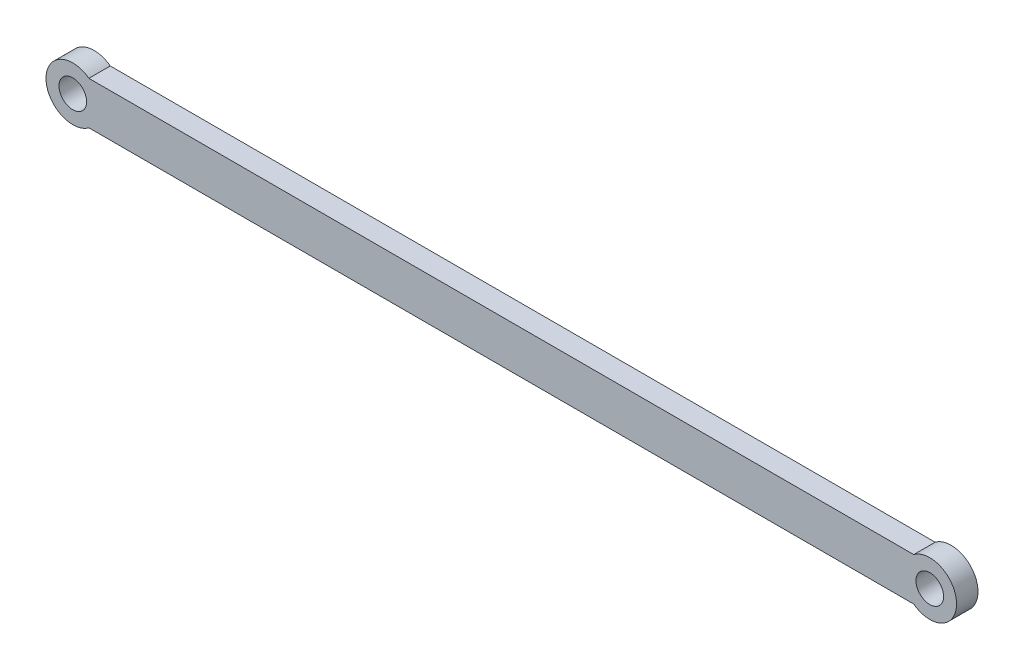
ISO-10303-21;
HEADER;
FILE_DESCRIPTION(('STEP AP214'),'2;1');
FILE_NAME('part.step','',(''),(''),'','','');
FILE_SCHEMA(('AUTOMOTIVE_DESIGN { 1 0 10303 214 1 1 1 1 }'));
ENDSEC;
DATA;
#1=APPLICATION_CONTEXT('core data for automotive mechanical design processes');
#2=APPLICATION_PROTOCOL_DEFINITION('international standard','automotive_design',2000,#1);
#3=PRODUCT_CONTEXT('',#1,'mechanical');
#4=PRODUCT('Part','Part','',(#3));
#5=PRODUCT_RELATED_PRODUCT_CATEGORY('part','',(#4));
#6=PRODUCT_DEFINITION_FORMATION('','',#4);
#7=PRODUCT_DEFINITION_CONTEXT('part definition',#1,'design');
#8=PRODUCT_DEFINITION('design','',#6,#7);
#9=PRODUCT_DEFINITION_SHAPE('','',#8);
#10=(LENGTH_UNIT() NAMED_UNIT(*) SI_UNIT(.MILLI.,.METRE.));
#11=(NAMED_UNIT(*) PLANE_ANGLE_UNIT() SI_UNIT($,.RADIAN.));
#12=(NAMED_UNIT(*) SI_UNIT($,.STERADIAN.) SOLID_ANGLE_UNIT());
#13=UNCERTAINTY_MEASURE_WITH_UNIT(LENGTH_MEASURE(1.E-05),#10,'distance_accuracy_value','');
#14=(GEOMETRIC_REPRESENTATION_CONTEXT(3) GLOBAL_UNCERTAINTY_ASSIGNED_CONTEXT((#13)) GLOBAL_UNIT_ASSIGNED_CONTEXT((#10,
#11,#12)) REPRESENTATION_CONTEXT('',''));
#15=CARTESIAN_POINT('',(0.,0.,0.));
#16=DIRECTION('',(0.,0.,1.));
#17=DIRECTION('',(1.,0.,0.));
#18=AXIS2_PLACEMENT_3D('',#15,#16,#17);
#19=CARTESIAN_POINT('',(0.,6.35,6.35));
#20=DIRECTION('',(0.,0.,-1.));
#21=DIRECTION('',(-1.,0.,0.));
#22=AXIS2_PLACEMENT_3D('',#19,#20,#21);
#23=CYLINDRICAL_SURFACE('',#22,7.9375);
#24=CARTESIAN_POINT('',(0.,6.35,0.));
#25=DIRECTION('',(0.,0.,1.));
#26=DIRECTION('',(1.,0.,0.));
#27=AXIS2_PLACEMENT_3D('',#24,#25,#26);
#28=CIRCLE('',#27,7.9375);
#29=CARTESIAN_POINT('',(4.7625,12.7,0.));
#30=VERTEX_POINT('',#29);
#31=CARTESIAN_POINT('',(4.7625,0.,0.));
#32=VERTEX_POINT('',#31);
#33=EDGE_CURVE('E107',#30,#32,#28,.T.);
#34=ORIENTED_EDGE('',*,*,#33,.T.);
#35=DIRECTION('',(0.,0.,-1.));
#36=VECTOR('',#35,1.);
#37=CARTESIAN_POINT('',(4.7625,0.,6.35));
#38=LINE('',#37,#36);
#39=CARTESIAN_POINT('',(4.7625,0.,6.35));
#40=VERTEX_POINT('',#39);
#41=EDGE_CURVE('E11',#40,#32,#38,.T.);
#42=ORIENTED_EDGE('',*,*,#41,.F.);
#43=CARTESIAN_POINT('',(0.,6.35,6.35));
#44=DIRECTION('',(0.,0.,1.));
#45=DIRECTION('',(1.,0.,0.));
#46=AXIS2_PLACEMENT_3D('',#43,#44,#45);
#47=CIRCLE('',#46,7.9375);
#48=CARTESIAN_POINT('',(4.7625,12.7,6.35));
#49=VERTEX_POINT('',#48);
#50=EDGE_CURVE('E91',#49,#40,#47,.T.);
#51=ORIENTED_EDGE('',*,*,#50,.F.);
#52=DIRECTION('',(0.,0.,-1.));
#53=VECTOR('',#52,1.);
#54=CARTESIAN_POINT('',(4.7625,12.7,6.35));
#55=LINE('',#54,#53);
#56=EDGE_CURVE('E103',#49,#30,#55,.T.);
#57=ORIENTED_EDGE('',*,*,#56,.T.);
#58=EDGE_LOOP('',(#34,#42,#51,#57));
#59=FACE_BOUND('',#58,.T.);
#60=ADVANCED_FACE('F39',(#59),#23,.T.);
#61=CARTESIAN_POINT('',(4.7625,0.,6.35));
#62=DIRECTION('',(0.,1.,0.));
#63=DIRECTION('',(0.,0.,1.));
#64=AXIS2_PLACEMENT_3D('',#61,#62,#63);
#65=PLANE('',#64);
#66=DIRECTION('',(1.,0.,0.));
#67=VECTOR('',#66,1.);
#68=CARTESIAN_POINT('',(4.7625,0.,0.));
#69=LINE('',#68,#67);
#70=CARTESIAN_POINT('',(249.2375,0.,0.));
#71=VERTEX_POINT('',#70);
#72=EDGE_CURVE('E96',#32,#71,#69,.T.);
#73=ORIENTED_EDGE('',*,*,#72,.T.);
#74=DIRECTION('',(0.,0.,-1.));
#75=VECTOR('',#74,1.);
#76=CARTESIAN_POINT('',(249.2375,0.,6.35));
#77=LINE('',#76,#75);
#78=CARTESIAN_POINT('',(249.2375,0.,6.35));
#79=VERTEX_POINT('',#78);
#80=EDGE_CURVE('E48',#79,#71,#77,.T.);
#81=ORIENTED_EDGE('',*,*,#80,.F.);
#82=DIRECTION('',(1.,0.,0.));
#83=VECTOR('',#82,1.);
#84=CARTESIAN_POINT('',(4.7625,0.,6.35));
#85=LINE('',#84,#83);
#86=EDGE_CURVE('E86',#40,#79,#85,.T.);
#87=ORIENTED_EDGE('',*,*,#86,.F.);
#88=ORIENTED_EDGE('',*,*,#41,.T.);
#89=EDGE_LOOP('',(#73,#81,#87,#88));
#90=FACE_BOUND('',#89,.T.);
#91=ADVANCED_FACE('F95',(#90),#65,.F.);
#92=CARTESIAN_POINT('',(254.,6.35,6.35));
#93=DIRECTION('',(0.,0.,-1.));
#94=DIRECTION('',(-1.,0.,0.));
#95=AXIS2_PLACEMENT_3D('',#92,#93,#94);
#96=CYLINDRICAL_SURFACE('',#95,7.93749999999998);
#97=CARTESIAN_POINT('',(254.,6.35,0.));
#98=DIRECTION('',(0.,0.,1.));
#99=DIRECTION('',(1.,0.,0.));
#100=AXIS2_PLACEMENT_3D('',#97,#98,#99);
#101=CIRCLE('',#100,7.93749999999998);
#102=CARTESIAN_POINT('',(249.2375,12.7,0.));
#103=VERTEX_POINT('',#102);
#104=EDGE_CURVE('E73',#71,#103,#101,.T.);
#105=ORIENTED_EDGE('',*,*,#104,.T.);
#106=DIRECTION('',(0.,0.,-1.));
#107=VECTOR('',#106,1.);
#108=CARTESIAN_POINT('',(249.2375,12.7,6.35));
#109=LINE('',#108,#107);
#110=CARTESIAN_POINT('',(249.2375,12.7,6.35));
#111=VERTEX_POINT('',#110);
#112=EDGE_CURVE('E98',#111,#103,#109,.T.);
#113=ORIENTED_EDGE('',*,*,#112,.F.);
#114=CARTESIAN_POINT('',(254.,6.35,6.35));
#115=DIRECTION('',(0.,0.,1.));
#116=DIRECTION('',(1.,0.,0.));
#117=AXIS2_PLACEMENT_3D('',#114,#115,#116);
#118=CIRCLE('',#117,7.93749999999998);
#119=EDGE_CURVE('E89',#79,#111,#118,.T.);
#120=ORIENTED_EDGE('',*,*,#119,.F.);
#121=ORIENTED_EDGE('',*,*,#80,.T.);
#122=EDGE_LOOP('',(#105,#113,#120,#121));
#123=FACE_BOUND('',#122,.T.);
#124=ADVANCED_FACE('F99',(#123),#96,.T.);
#125=CARTESIAN_POINT('',(4.7625,12.7,6.35));
#126=DIRECTION('',(0.,-1.,0.));
#127=DIRECTION('',(0.,0.,-1.));
#128=AXIS2_PLACEMENT_3D('',#125,#126,#127);
#129=PLANE('',#128);
#130=DIRECTION('',(-1.,0.,0.));
#131=VECTOR('',#130,1.);
#132=CARTESIAN_POINT('',(4.7625,12.7,0.));
#133=LINE('',#132,#131);
#134=EDGE_CURVE('E79',#103,#30,#133,.T.);
#135=ORIENTED_EDGE('',*,*,#134,.T.);
#136=ORIENTED_EDGE('',*,*,#56,.F.);
#137=DIRECTION('',(-1.,0.,0.));
#138=VECTOR('',#137,1.);
#139=CARTESIAN_POINT('',(4.7625,12.7,6.35));
#140=LINE('',#139,#138);
#141=EDGE_CURVE('E56',#111,#49,#140,.T.);
#142=ORIENTED_EDGE('',*,*,#141,.F.);
#143=ORIENTED_EDGE('',*,*,#112,.T.);
#144=EDGE_LOOP('',(#135,#136,#142,#143));
#145=FACE_BOUND('',#144,.T.);
#146=ADVANCED_FACE('F121',(#145),#129,.F.);
#147=CARTESIAN_POINT('',(0.,6.35,6.35));
#148=DIRECTION('',(0.,0.,1.));
#149=DIRECTION('',(1.,0.,0.));
#150=AXIS2_PLACEMENT_3D('',#147,#148,#149);
#151=PLANE('',#150);
#152=CARTESIAN_POINT('',(254.,6.35,6.35));
#153=DIRECTION('',(0.,0.,1.));
#154=DIRECTION('',(1.,0.,0.));
#155=AXIS2_PLACEMENT_3D('',#152,#153,#154);
#156=CIRCLE('',#155,4.09575000000001);
#157=CARTESIAN_POINT('',(258.09575,6.35,6.35));
#158=VERTEX_POINT('',#157);
#159=EDGE_CURVE('E111',#158,#158,#156,.F.);
#160=ORIENTED_EDGE('',*,*,#159,.T.);
#161=EDGE_LOOP('',(#160));
#162=FACE_BOUND('',#161,.T.);
#163=CARTESIAN_POINT('',(0.,6.35,6.35));
#164=DIRECTION('',(0.,0.,1.));
#165=DIRECTION('',(1.,0.,0.));
#166=AXIS2_PLACEMENT_3D('',#163,#164,#165);
#167=CIRCLE('',#166,4.09575);
#168=CARTESIAN_POINT('',(4.09575,6.35,6.35));
#169=VERTEX_POINT('',#168);
#170=EDGE_CURVE('E128',#169,#169,#167,.F.);
#171=ORIENTED_EDGE('',*,*,#170,.T.);
#172=EDGE_LOOP('',(#171));
#173=FACE_BOUND('',#172,.T.);
#174=ORIENTED_EDGE('',*,*,#50,.T.);
#175=ORIENTED_EDGE('',*,*,#86,.T.);
#176=ORIENTED_EDGE('',*,*,#119,.T.);
#177=ORIENTED_EDGE('',*,*,#141,.T.);
#178=EDGE_LOOP('',(#174,#175,#176,#177));
#179=FACE_BOUND('',#178,.T.);
#180=ADVANCED_FACE('F87',(#162,#173,#179),#151,.T.);
#181=CARTESIAN_POINT('',(0.,6.35,0.));
#182=DIRECTION('',(0.,0.,1.));
#183=DIRECTION('',(1.,0.,0.));
#184=AXIS2_PLACEMENT_3D('',#181,#182,#183);
#185=PLANE('',#184);
#186=CARTESIAN_POINT('',(254.,6.35,0.));
#187=DIRECTION('',(0.,0.,-1.));
#188=DIRECTION('',(-1.,0.,0.));
#189=AXIS2_PLACEMENT_3D('',#186,#187,#188);
#190=CIRCLE('',#189,4.09575000000001);
#191=CARTESIAN_POINT('',(249.90425,6.35,0.));
#192=VERTEX_POINT('',#191);
#193=EDGE_CURVE('E132',#192,#192,#190,.T.);
#194=ORIENTED_EDGE('',*,*,#193,.F.);
#195=EDGE_LOOP('',(#194));
#196=FACE_BOUND('',#195,.T.);
#197=CARTESIAN_POINT('',(0.,6.35,0.));
#198=DIRECTION('',(0.,0.,-1.));
#199=DIRECTION('',(-1.,0.,0.));
#200=AXIS2_PLACEMENT_3D('',#197,#198,#199);
#201=CIRCLE('',#200,4.09575);
#202=CARTESIAN_POINT('',(-4.09575,6.35,0.));
#203=VERTEX_POINT('',#202);
#204=EDGE_CURVE('E133',#203,#203,#201,.T.);
#205=ORIENTED_EDGE('',*,*,#204,.F.);
#206=EDGE_LOOP('',(#205));
#207=FACE_BOUND('',#206,.T.);
#208=ORIENTED_EDGE('',*,*,#33,.F.);
#209=ORIENTED_EDGE('',*,*,#134,.F.);
#210=ORIENTED_EDGE('',*,*,#104,.F.);
#211=ORIENTED_EDGE('',*,*,#72,.F.);
#212=EDGE_LOOP('',(#208,#209,#210,#211));
#213=FACE_BOUND('',#212,.T.);
#214=ADVANCED_FACE('F124',(#196,#207,#213),#185,.F.);
#215=CARTESIAN_POINT('',(0.,6.35,17.9345303961792));
#216=DIRECTION('',(0.,0.,-1.));
#217=DIRECTION('',(-1.,0.,0.));
#218=AXIS2_PLACEMENT_3D('',#215,#216,#217);
#219=CYLINDRICAL_SURFACE('',#218,4.09575);
#220=ORIENTED_EDGE('',*,*,#204,.T.);
#221=EDGE_LOOP('',(#220));
#222=FACE_BOUND('',#221,.T.);
#223=ORIENTED_EDGE('',*,*,#170,.F.);
#224=EDGE_LOOP('',(#223));
#225=FACE_BOUND('',#224,.T.);
#226=ADVANCED_FACE('F149',(#222,#225),#219,.F.);
#227=CARTESIAN_POINT('',(254.,6.35,17.9345303961792));
#228=DIRECTION('',(0.,0.,-1.));
#229=DIRECTION('',(-1.,0.,0.));
#230=AXIS2_PLACEMENT_3D('',#227,#228,#229);
#231=CYLINDRICAL_SURFACE('',#230,4.09575000000001);
#232=ORIENTED_EDGE('',*,*,#193,.T.);
#233=EDGE_LOOP('',(#232));
#234=FACE_BOUND('',#233,.T.);
#235=ORIENTED_EDGE('',*,*,#159,.F.);
#236=EDGE_LOOP('',(#235));
#237=FACE_BOUND('',#236,.T.);
#238=ADVANCED_FACE('F144',(#234,#237),#231,.F.);
#239=CLOSED_SHELL('',(#60,#91,#124,#146,#180,#214,#226,#238));
#240=MANIFOLD_SOLID_BREP('B2',#239);
#241=ADVANCED_BREP_SHAPE_REPRESENTATION('',(#18,#240),#14);
#242=SHAPE_DEFINITION_REPRESENTATION(#9,#241);
ENDSEC;
END-ISO-10303-21;
